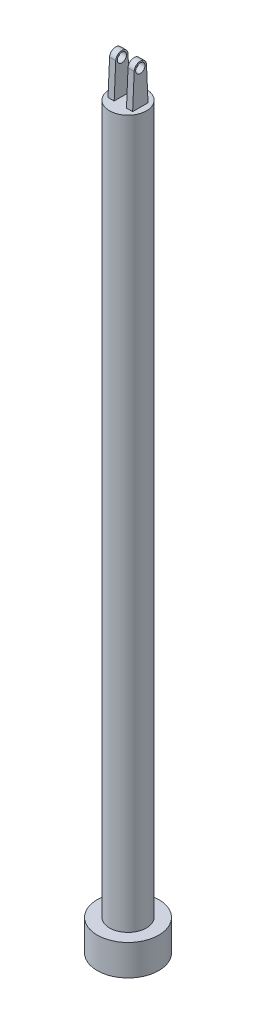
ISO-10303-21;
HEADER;
FILE_DESCRIPTION(('STEP AP214'),'2;1');
FILE_NAME('part.step','',(''),(''),'','','');
FILE_SCHEMA(('AUTOMOTIVE_DESIGN { 1 0 10303 214 1 1 1 1 }'));
ENDSEC;
DATA;
#1=APPLICATION_CONTEXT('core data for automotive mechanical design processes');
#2=APPLICATION_PROTOCOL_DEFINITION('international standard','automotive_design',2000,#1);
#3=PRODUCT_CONTEXT('',#1,'mechanical');
#4=PRODUCT('Part','Part','',(#3));
#5=PRODUCT_RELATED_PRODUCT_CATEGORY('part','',(#4));
#6=PRODUCT_DEFINITION_FORMATION('','',#4);
#7=PRODUCT_DEFINITION_CONTEXT('part definition',#1,'design');
#8=PRODUCT_DEFINITION('design','',#6,#7);
#9=PRODUCT_DEFINITION_SHAPE('','',#8);
#10=(LENGTH_UNIT() NAMED_UNIT(*) SI_UNIT(.MILLI.,.METRE.));
#11=(NAMED_UNIT(*) PLANE_ANGLE_UNIT() SI_UNIT($,.RADIAN.));
#12=(NAMED_UNIT(*) SI_UNIT($,.STERADIAN.) SOLID_ANGLE_UNIT());
#13=UNCERTAINTY_MEASURE_WITH_UNIT(LENGTH_MEASURE(1.E-05),#10,'distance_accuracy_value','');
#14=(GEOMETRIC_REPRESENTATION_CONTEXT(3) GLOBAL_UNCERTAINTY_ASSIGNED_CONTEXT((#13)) GLOBAL_UNIT_ASSIGNED_CONTEXT((#10,
#11,#12)) REPRESENTATION_CONTEXT('',''));
#15=CARTESIAN_POINT('',(0.,0.,0.));
#16=DIRECTION('',(0.,0.,1.));
#17=DIRECTION('',(1.,0.,0.));
#18=AXIS2_PLACEMENT_3D('',#15,#16,#17);
#19=CARTESIAN_POINT('',(0.,120.,0.));
#20=DIRECTION('',(0.,-1.,0.));
#21=DIRECTION('',(0.,0.,-1.));
#22=AXIS2_PLACEMENT_3D('',#19,#20,#21);
#23=PLANE('',#22);
#24=DIRECTION('',(1.,0.,0.));
#25=VECTOR('',#24,1.);
#26=CARTESIAN_POINT('',(0.,120.,1.25));
#27=LINE('',#26,#25);
#28=CARTESIAN_POINT('',(1.,120.,1.25));
#29=VERTEX_POINT('',#28);
#30=CARTESIAN_POINT('',(2.,120.,1.25));
#31=VERTEX_POINT('',#30);
#32=EDGE_CURVE('E127',#29,#31,#27,.T.);
#33=ORIENTED_EDGE('',*,*,#32,.F.);
#34=DIRECTION('',(0.,0.,1.));
#35=VECTOR('',#34,1.);
#36=CARTESIAN_POINT('',(1.,120.,0.));
#37=LINE('',#36,#35);
#38=CARTESIAN_POINT('',(1.,120.,-1.25));
#39=VERTEX_POINT('',#38);
#40=EDGE_CURVE('E169',#39,#29,#37,.T.);
#41=ORIENTED_EDGE('',*,*,#40,.F.);
#42=DIRECTION('',(1.,0.,0.));
#43=VECTOR('',#42,1.);
#44=CARTESIAN_POINT('',(0.,120.,-1.25));
#45=LINE('',#44,#43);
#46=CARTESIAN_POINT('',(2.,120.,-1.25));
#47=VERTEX_POINT('',#46);
#48=EDGE_CURVE('E164',#39,#47,#45,.T.);
#49=ORIENTED_EDGE('',*,*,#48,.T.);
#50=DIRECTION('',(0.,0.,1.));
#51=VECTOR('',#50,1.);
#52=CARTESIAN_POINT('',(2.,120.,0.));
#53=LINE('',#52,#51);
#54=EDGE_CURVE('E123',#47,#31,#53,.T.);
#55=ORIENTED_EDGE('',*,*,#54,.T.);
#56=EDGE_LOOP('',(#33,#41,#49,#55));
#57=FACE_BOUND('',#56,.T.);
#58=CARTESIAN_POINT('',(0.,120.,0.));
#59=DIRECTION('',(0.,-1.,0.));
#60=DIRECTION('',(0.,0.,-1.));
#61=AXIS2_PLACEMENT_3D('',#58,#59,#60);
#62=CIRCLE('',#61,3.);
#63=CARTESIAN_POINT('',(0.,120.,-3.));
#64=VERTEX_POINT('',#63);
#65=EDGE_CURVE('E140',#64,#64,#62,.T.);
#66=ORIENTED_EDGE('',*,*,#65,.F.);
#67=EDGE_LOOP('',(#66));
#68=FACE_BOUND('',#67,.T.);
#69=DIRECTION('',(0.,0.,1.));
#70=VECTOR('',#69,1.);
#71=CARTESIAN_POINT('',(-0.999999999999999,120.,0.));
#72=LINE('',#71,#70);
#73=CARTESIAN_POINT('',(-1.,120.,-1.25));
#74=VERTEX_POINT('',#73);
#75=CARTESIAN_POINT('',(-0.999999999999999,120.,1.25));
#76=VERTEX_POINT('',#75);
#77=EDGE_CURVE('E111',#74,#76,#72,.T.);
#78=ORIENTED_EDGE('',*,*,#77,.T.);
#79=DIRECTION('',(1.,0.,0.));
#80=VECTOR('',#79,1.);
#81=CARTESIAN_POINT('',(0.,120.,1.25));
#82=LINE('',#81,#80);
#83=CARTESIAN_POINT('',(-2.,120.,1.25));
#84=VERTEX_POINT('',#83);
#85=EDGE_CURVE('E122',#84,#76,#82,.T.);
#86=ORIENTED_EDGE('',*,*,#85,.F.);
#87=DIRECTION('',(0.,0.,1.));
#88=VECTOR('',#87,1.);
#89=CARTESIAN_POINT('',(-2.,120.,0.));
#90=LINE('',#89,#88);
#91=CARTESIAN_POINT('',(-2.,120.,-1.25));
#92=VERTEX_POINT('',#91);
#93=EDGE_CURVE('E117',#92,#84,#90,.T.);
#94=ORIENTED_EDGE('',*,*,#93,.F.);
#95=DIRECTION('',(1.,0.,0.));
#96=VECTOR('',#95,1.);
#97=CARTESIAN_POINT('',(0.,120.,-1.25));
#98=LINE('',#97,#96);
#99=EDGE_CURVE('E102',#92,#74,#98,.T.);
#100=ORIENTED_EDGE('',*,*,#99,.T.);
#101=EDGE_LOOP('',(#78,#86,#94,#100));
#102=FACE_BOUND('',#101,.T.);
#103=ADVANCED_FACE('F38',(#57,#68,#102),#23,.F.);
#104=CARTESIAN_POINT('',(0.,0.,0.));
#105=DIRECTION('',(0.,-1.,0.));
#106=DIRECTION('',(0.,0.,-1.));
#107=AXIS2_PLACEMENT_3D('',#104,#105,#106);
#108=CYLINDRICAL_SURFACE('',#107,3.);
#109=ORIENTED_EDGE('',*,*,#65,.T.);
#110=EDGE_LOOP('',(#109));
#111=FACE_BOUND('',#110,.T.);
#112=CARTESIAN_POINT('',(0.,5.,0.));
#113=DIRECTION('',(0.,-1.,0.));
#114=DIRECTION('',(0.,0.,-1.));
#115=AXIS2_PLACEMENT_3D('',#112,#113,#114);
#116=CIRCLE('',#115,3.);
#117=CARTESIAN_POINT('',(0.,5.,-3.));
#118=VERTEX_POINT('',#117);
#119=EDGE_CURVE('E110',#118,#118,#116,.T.);
#120=ORIENTED_EDGE('',*,*,#119,.F.);
#121=EDGE_LOOP('',(#120));
#122=FACE_BOUND('',#121,.T.);
#123=ADVANCED_FACE('F40',(#111,#122),#108,.T.);
#124=CARTESIAN_POINT('',(0.,0.,0.));
#125=DIRECTION('',(0.,-1.,0.));
#126=DIRECTION('',(0.,0.,-1.));
#127=AXIS2_PLACEMENT_3D('',#124,#125,#126);
#128=PLANE('',#127);
#129=CARTESIAN_POINT('',(0.,0.,0.));
#130=DIRECTION('',(0.,-1.,0.));
#131=DIRECTION('',(0.,0.,-1.));
#132=AXIS2_PLACEMENT_3D('',#129,#130,#131);
#133=CIRCLE('',#132,5.);
#134=CARTESIAN_POINT('',(0.,0.,-5.));
#135=VERTEX_POINT('',#134);
#136=EDGE_CURVE('E137',#135,#135,#133,.T.);
#137=ORIENTED_EDGE('',*,*,#136,.T.);
#138=EDGE_LOOP('',(#137));
#139=FACE_BOUND('',#138,.T.);
#140=ADVANCED_FACE('F236',(#139),#128,.T.);
#141=CARTESIAN_POINT('',(0.,0.,0.));
#142=DIRECTION('',(0.,-1.,0.));
#143=DIRECTION('',(0.,0.,-1.));
#144=AXIS2_PLACEMENT_3D('',#141,#142,#143);
#145=CYLINDRICAL_SURFACE('',#144,5.);
#146=CARTESIAN_POINT('',(0.,5.,0.));
#147=DIRECTION('',(0.,-1.,0.));
#148=DIRECTION('',(0.,0.,-1.));
#149=AXIS2_PLACEMENT_3D('',#146,#147,#148);
#150=CIRCLE('',#149,5.);
#151=CARTESIAN_POINT('',(0.,5.,-5.));
#152=VERTEX_POINT('',#151);
#153=EDGE_CURVE('E134',#152,#152,#150,.T.);
#154=ORIENTED_EDGE('',*,*,#153,.T.);
#155=EDGE_LOOP('',(#154));
#156=FACE_BOUND('',#155,.T.);
#157=ORIENTED_EDGE('',*,*,#136,.F.);
#158=EDGE_LOOP('',(#157));
#159=FACE_BOUND('',#158,.T.);
#160=ADVANCED_FACE('F229',(#156,#159),#145,.T.);
#161=CARTESIAN_POINT('',(0.,5.,0.));
#162=DIRECTION('',(0.,1.,0.));
#163=DIRECTION('',(0.,0.,1.));
#164=AXIS2_PLACEMENT_3D('',#161,#162,#163);
#165=PLANE('',#164);
#166=ORIENTED_EDGE('',*,*,#119,.T.);
#167=EDGE_LOOP('',(#166));
#168=FACE_BOUND('',#167,.T.);
#169=ORIENTED_EDGE('',*,*,#153,.F.);
#170=EDGE_LOOP('',(#169));
#171=FACE_BOUND('',#170,.T.);
#172=ADVANCED_FACE('F224',(#168,#171),#165,.T.);
#173=CARTESIAN_POINT('',(-2.,127.,0.));
#174=DIRECTION('',(1.,0.,0.));
#175=DIRECTION('',(0.,0.,-1.));
#176=AXIS2_PLACEMENT_3D('',#173,#174,#175);
#177=PLANE('',#176);
#178=CARTESIAN_POINT('',(-2.,125.5,0.));
#179=DIRECTION('',(-1.,0.,0.));
#180=DIRECTION('',(0.,0.,1.));
#181=AXIS2_PLACEMENT_3D('',#178,#179,#180);
#182=CIRCLE('',#181,0.750000000000001);
#183=CARTESIAN_POINT('',(-2.,125.5,0.750000000000001));
#184=VERTEX_POINT('',#183);
#185=EDGE_CURVE('E148',#184,#184,#182,.T.);
#186=ORIENTED_EDGE('',*,*,#185,.F.);
#187=EDGE_LOOP('',(#186));
#188=FACE_BOUND('',#187,.T.);
#189=ORIENTED_EDGE('',*,*,#93,.T.);
#190=DIRECTION('',(0.,-0.9989769604044,0.0452220364555453));
#191=VECTOR('',#190,1.);
#192=CARTESIAN_POINT('',(-2.,120.,1.25));
#193=LINE('',#192,#191);
#194=CARTESIAN_POINT('',(-2.,125.545222036456,0.998976960404402));
#195=VERTEX_POINT('',#194);
#196=EDGE_CURVE('E198',#195,#84,#193,.T.);
#197=ORIENTED_EDGE('',*,*,#196,.F.);
#198=CARTESIAN_POINT('',(-2.,125.5,0.));
#199=DIRECTION('',(1.,0.,0.));
#200=DIRECTION('',(0.,0.,1.));
#201=AXIS2_PLACEMENT_3D('',#198,#199,#200);
#202=CIRCLE('',#201,1.);
#203=CARTESIAN_POINT('',(-2.,125.545222036456,-0.998976960404403));
#204=VERTEX_POINT('',#203);
#205=EDGE_CURVE('E120',#204,#195,#202,.T.);
#206=ORIENTED_EDGE('',*,*,#205,.F.);
#207=DIRECTION('',(0.,0.9989769604044,0.0452220364555448));
#208=VECTOR('',#207,1.);
#209=CARTESIAN_POINT('',(-2.,120.,-1.25));
#210=LINE('',#209,#208);
#211=EDGE_CURVE('E105',#92,#204,#210,.T.);
#212=ORIENTED_EDGE('',*,*,#211,.F.);
#213=EDGE_LOOP('',(#189,#197,#206,#212));
#214=FACE_BOUND('',#213,.T.);
#215=ADVANCED_FACE('F115',(#188,#214),#177,.F.);
#216=CARTESIAN_POINT('',(-0.999999999999999,127.,0.));
#217=DIRECTION('',(1.,0.,0.));
#218=DIRECTION('',(0.,0.,-1.));
#219=AXIS2_PLACEMENT_3D('',#216,#217,#218);
#220=PLANE('',#219);
#221=DIRECTION('',(0.,0.9989769604044,-0.0452220364555453));
#222=VECTOR('',#221,1.);
#223=CARTESIAN_POINT('',(-0.999999999999999,127.042154487584,0.931213301621912));
#224=LINE('',#223,#222);
#225=CARTESIAN_POINT('',(-0.999999999999999,125.545222036456,0.998976960404401));
#226=VERTEX_POINT('',#225);
#227=EDGE_CURVE('E170',#76,#226,#224,.T.);
#228=ORIENTED_EDGE('',*,*,#227,.F.);
#229=ORIENTED_EDGE('',*,*,#77,.F.);
#230=DIRECTION('',(0.,-0.9989769604044,-0.0452220364555448));
#231=VECTOR('',#230,1.);
#232=CARTESIAN_POINT('',(-0.999999999999999,127.042154487584,-0.931213301621918));
#233=LINE('',#232,#231);
#234=CARTESIAN_POINT('',(-0.999999999999999,125.545222036456,-0.998976960404403));
#235=VERTEX_POINT('',#234);
#236=EDGE_CURVE('E61',#235,#74,#233,.T.);
#237=ORIENTED_EDGE('',*,*,#236,.F.);
#238=CARTESIAN_POINT('',(-0.999999999999999,125.5,0.));
#239=DIRECTION('',(1.,0.,0.));
#240=DIRECTION('',(0.,0.,-1.));
#241=AXIS2_PLACEMENT_3D('',#238,#239,#240);
#242=CIRCLE('',#241,1.);
#243=EDGE_CURVE('E186',#226,#235,#242,.F.);
#244=ORIENTED_EDGE('',*,*,#243,.F.);
#245=EDGE_LOOP('',(#228,#229,#237,#244));
#246=FACE_BOUND('',#245,.T.);
#247=CARTESIAN_POINT('',(-0.999999999999999,125.5,0.));
#248=DIRECTION('',(1.,0.,0.));
#249=DIRECTION('',(0.,0.,-1.));
#250=AXIS2_PLACEMENT_3D('',#247,#248,#249);
#251=CIRCLE('',#250,0.750000000000001);
#252=CARTESIAN_POINT('',(-0.999999999999999,125.5,-0.750000000000001));
#253=VERTEX_POINT('',#252);
#254=EDGE_CURVE('E178',#253,#253,#251,.T.);
#255=ORIENTED_EDGE('',*,*,#254,.F.);
#256=EDGE_LOOP('',(#255));
#257=FACE_BOUND('',#256,.T.);
#258=ADVANCED_FACE('F210',(#246,#257),#220,.T.);
#259=CARTESIAN_POINT('',(1.,127.,0.));
#260=DIRECTION('',(1.,0.,0.));
#261=DIRECTION('',(0.,0.,-1.));
#262=AXIS2_PLACEMENT_3D('',#259,#260,#261);
#263=PLANE('',#262);
#264=CARTESIAN_POINT('',(1.,125.5,0.));
#265=DIRECTION('',(1.,0.,0.));
#266=DIRECTION('',(0.,0.,-1.));
#267=AXIS2_PLACEMENT_3D('',#264,#265,#266);
#268=CIRCLE('',#267,0.750000000000001);
#269=CARTESIAN_POINT('',(1.,125.5,-0.750000000000001));
#270=VERTEX_POINT('',#269);
#271=EDGE_CURVE('E147',#270,#270,#268,.T.);
#272=ORIENTED_EDGE('',*,*,#271,.T.);
#273=EDGE_LOOP('',(#272));
#274=FACE_BOUND('',#273,.T.);
#275=ORIENTED_EDGE('',*,*,#40,.T.);
#276=DIRECTION('',(0.,0.9989769604044,-0.0452220364555453));
#277=VECTOR('',#276,1.);
#278=CARTESIAN_POINT('',(1.,127.042154487584,0.931213301621912));
#279=LINE('',#278,#277);
#280=CARTESIAN_POINT('',(1.,125.545222036456,0.998976960404401));
#281=VERTEX_POINT('',#280);
#282=EDGE_CURVE('E184',#29,#281,#279,.T.);
#283=ORIENTED_EDGE('',*,*,#282,.T.);
#284=CARTESIAN_POINT('',(1.,125.5,0.));
#285=DIRECTION('',(1.,0.,0.));
#286=DIRECTION('',(0.,0.,-1.));
#287=AXIS2_PLACEMENT_3D('',#284,#285,#286);
#288=CIRCLE('',#287,1.);
#289=CARTESIAN_POINT('',(1.,125.545222036456,-0.998976960404404));
#290=VERTEX_POINT('',#289);
#291=EDGE_CURVE('E177',#281,#290,#288,.F.);
#292=ORIENTED_EDGE('',*,*,#291,.T.);
#293=DIRECTION('',(0.,-0.9989769604044,-0.0452220364555448));
#294=VECTOR('',#293,1.);
#295=CARTESIAN_POINT('',(1.,127.042154487584,-0.931213301621918));
#296=LINE('',#295,#294);
#297=EDGE_CURVE('E166',#290,#39,#296,.T.);
#298=ORIENTED_EDGE('',*,*,#297,.T.);
#299=EDGE_LOOP('',(#275,#283,#292,#298));
#300=FACE_BOUND('',#299,.T.);
#301=ADVANCED_FACE('F174',(#274,#300),#263,.F.);
#302=CARTESIAN_POINT('',(2.,127.,0.));
#303=DIRECTION('',(1.,0.,0.));
#304=DIRECTION('',(0.,0.,-1.));
#305=AXIS2_PLACEMENT_3D('',#302,#303,#304);
#306=PLANE('',#305);
#307=DIRECTION('',(0.,0.9989769604044,-0.0452220364555453));
#308=VECTOR('',#307,1.);
#309=CARTESIAN_POINT('',(2.,127.042154487584,0.931213301621912));
#310=LINE('',#309,#308);
#311=CARTESIAN_POINT('',(2.,125.545222036456,0.998976960404401));
#312=VERTEX_POINT('',#311);
#313=EDGE_CURVE('E11',#31,#312,#310,.T.);
#314=ORIENTED_EDGE('',*,*,#313,.F.);
#315=ORIENTED_EDGE('',*,*,#54,.F.);
#316=DIRECTION('',(0.,-0.9989769604044,-0.0452220364555448));
#317=VECTOR('',#316,1.);
#318=CARTESIAN_POINT('',(2.,127.042154487584,-0.931213301621918));
#319=LINE('',#318,#317);
#320=CARTESIAN_POINT('',(2.,125.545222036456,-0.998976960404404));
#321=VERTEX_POINT('',#320);
#322=EDGE_CURVE('E143',#321,#47,#319,.T.);
#323=ORIENTED_EDGE('',*,*,#322,.F.);
#324=CARTESIAN_POINT('',(2.,125.5,0.));
#325=DIRECTION('',(1.,0.,0.));
#326=DIRECTION('',(0.,0.,-1.));
#327=AXIS2_PLACEMENT_3D('',#324,#325,#326);
#328=CIRCLE('',#327,1.);
#329=EDGE_CURVE('E46',#312,#321,#328,.F.);
#330=ORIENTED_EDGE('',*,*,#329,.F.);
#331=EDGE_LOOP('',(#314,#315,#323,#330));
#332=FACE_BOUND('',#331,.T.);
#333=CARTESIAN_POINT('',(2.,125.5,0.));
#334=DIRECTION('',(1.,0.,0.));
#335=DIRECTION('',(0.,0.,-1.));
#336=AXIS2_PLACEMENT_3D('',#333,#334,#335);
#337=CIRCLE('',#336,0.750000000000001);
#338=CARTESIAN_POINT('',(2.,125.5,-0.750000000000001));
#339=VERTEX_POINT('',#338);
#340=EDGE_CURVE('E144',#339,#339,#337,.T.);
#341=ORIENTED_EDGE('',*,*,#340,.F.);
#342=EDGE_LOOP('',(#341));
#343=FACE_BOUND('',#342,.T.);
#344=ADVANCED_FACE('F160',(#332,#343),#306,.T.);
#345=CARTESIAN_POINT('',(5.,125.5,0.));
#346=DIRECTION('',(-1.,0.,0.));
#347=DIRECTION('',(0.,0.,1.));
#348=AXIS2_PLACEMENT_3D('',#345,#346,#347);
#349=CYLINDRICAL_SURFACE('',#348,0.750000000000001);
#350=ORIENTED_EDGE('',*,*,#340,.T.);
#351=EDGE_LOOP('',(#350));
#352=FACE_BOUND('',#351,.T.);
#353=ORIENTED_EDGE('',*,*,#271,.F.);
#354=EDGE_LOOP('',(#353));
#355=FACE_BOUND('',#354,.T.);
#356=ADVANCED_FACE('F220',(#352,#355),#349,.F.);
#357=CARTESIAN_POINT('',(5.,120.,-1.25));
#358=DIRECTION('',(0.,-0.0452220364555448,0.9989769604044));
#359=DIRECTION('',(0.,-0.9989769604044,-0.0452220364555448));
#360=AXIS2_PLACEMENT_3D('',#357,#358,#359);
#361=PLANE('',#360);
#362=DIRECTION('',(-1.,0.,0.));
#363=VECTOR('',#362,1.);
#364=CARTESIAN_POINT('',(5.,125.545222036456,-0.998976960404404));
#365=LINE('',#364,#363);
#366=EDGE_CURVE('E53',#321,#290,#365,.T.);
#367=ORIENTED_EDGE('',*,*,#366,.F.);
#368=ORIENTED_EDGE('',*,*,#322,.T.);
#369=ORIENTED_EDGE('',*,*,#48,.F.);
#370=ORIENTED_EDGE('',*,*,#297,.F.);
#371=EDGE_LOOP('',(#367,#368,#369,#370));
#372=FACE_BOUND('',#371,.T.);
#373=ADVANCED_FACE('F163',(#372),#361,.F.);
#374=CARTESIAN_POINT('',(5.,125.5,0.));
#375=DIRECTION('',(-1.,0.,0.));
#376=DIRECTION('',(0.,0.,1.));
#377=AXIS2_PLACEMENT_3D('',#374,#375,#376);
#378=CYLINDRICAL_SURFACE('',#377,1.);
#379=DIRECTION('',(-1.,0.,0.));
#380=VECTOR('',#379,1.);
#381=CARTESIAN_POINT('',(5.,125.545222036456,0.9989769604044));
#382=LINE('',#381,#380);
#383=EDGE_CURVE('E156',#312,#281,#382,.T.);
#384=ORIENTED_EDGE('',*,*,#383,.F.);
#385=ORIENTED_EDGE('',*,*,#329,.T.);
#386=ORIENTED_EDGE('',*,*,#366,.T.);
#387=ORIENTED_EDGE('',*,*,#291,.F.);
#388=EDGE_LOOP('',(#384,#385,#386,#387));
#389=FACE_BOUND('',#388,.T.);
#390=ADVANCED_FACE('F153',(#389),#378,.T.);
#391=CARTESIAN_POINT('',(5.,120.,1.25));
#392=DIRECTION('',(0.,-0.0452220364555453,-0.9989769604044));
#393=DIRECTION('',(0.,0.9989769604044,-0.0452220364555453));
#394=AXIS2_PLACEMENT_3D('',#391,#392,#393);
#395=PLANE('',#394);
#396=ORIENTED_EDGE('',*,*,#32,.T.);
#397=ORIENTED_EDGE('',*,*,#313,.T.);
#398=ORIENTED_EDGE('',*,*,#383,.T.);
#399=ORIENTED_EDGE('',*,*,#282,.F.);
#400=EDGE_LOOP('',(#396,#397,#398,#399));
#401=FACE_BOUND('',#400,.T.);
#402=ADVANCED_FACE('F320',(#401),#395,.F.);
#403=ORIENTED_EDGE('',*,*,#227,.T.);
#404=EDGE_CURVE('E199',#226,#195,#382,.T.);
#405=ORIENTED_EDGE('',*,*,#404,.T.);
#406=ORIENTED_EDGE('',*,*,#196,.T.);
#407=ORIENTED_EDGE('',*,*,#85,.T.);
#408=EDGE_LOOP('',(#403,#405,#406,#407));
#409=FACE_BOUND('',#408,.T.);
#410=ADVANCED_FACE('F207',(#409),#395,.F.);
#411=ORIENTED_EDGE('',*,*,#243,.T.);
#412=EDGE_CURVE('E196',#235,#204,#365,.T.);
#413=ORIENTED_EDGE('',*,*,#412,.T.);
#414=ORIENTED_EDGE('',*,*,#205,.T.);
#415=ORIENTED_EDGE('',*,*,#404,.F.);
#416=EDGE_LOOP('',(#411,#413,#414,#415));
#417=FACE_BOUND('',#416,.T.);
#418=ADVANCED_FACE('F204',(#417),#378,.T.);
#419=ORIENTED_EDGE('',*,*,#236,.T.);
#420=ORIENTED_EDGE('',*,*,#99,.F.);
#421=ORIENTED_EDGE('',*,*,#211,.T.);
#422=ORIENTED_EDGE('',*,*,#412,.F.);
#423=EDGE_LOOP('',(#419,#420,#421,#422));
#424=FACE_BOUND('',#423,.T.);
#425=ADVANCED_FACE('F104',(#424),#361,.F.);
#426=ORIENTED_EDGE('',*,*,#254,.T.);
#427=EDGE_LOOP('',(#426));
#428=FACE_BOUND('',#427,.T.);
#429=ORIENTED_EDGE('',*,*,#185,.T.);
#430=EDGE_LOOP('',(#429));
#431=FACE_BOUND('',#430,.T.);
#432=ADVANCED_FACE('F216',(#428,#431),#349,.F.);
#433=CLOSED_SHELL('',(#103,#123,#140,#160,#172,#215,#258,#301,#344,#356,#373,#390,#402,#410,
#418,#425,#432));
#434=MANIFOLD_SOLID_BREP('B2',#433);
#435=ADVANCED_BREP_SHAPE_REPRESENTATION('',(#18,#434),#14);
#436=SHAPE_DEFINITION_REPRESENTATION(#9,#435);
ENDSEC;
END-ISO-10303-21;
